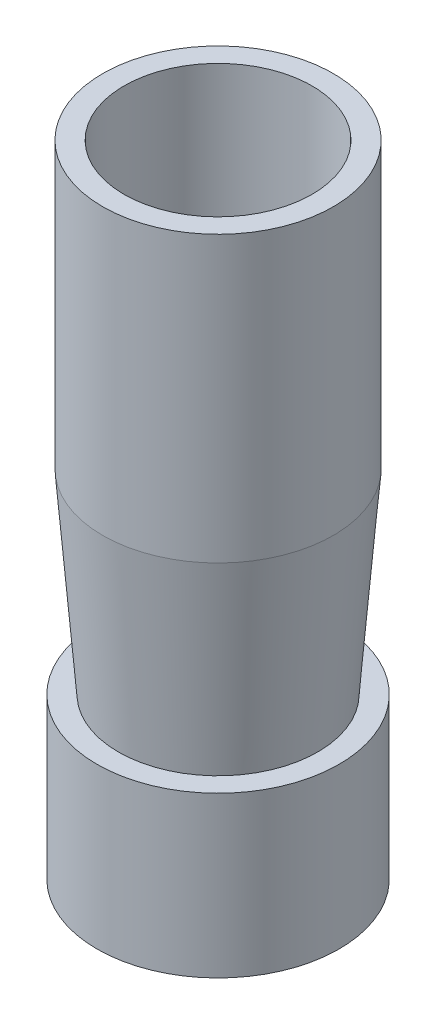
ISO-10303-21;
HEADER;
FILE_DESCRIPTION(('STEP AP214'),'2;1');
FILE_NAME('part.step','',(''),(''),'','','');
FILE_SCHEMA(('AUTOMOTIVE_DESIGN { 1 0 10303 214 1 1 1 1 }'));
ENDSEC;
DATA;
#1=APPLICATION_CONTEXT('core data for automotive mechanical design processes');
#2=APPLICATION_PROTOCOL_DEFINITION('international standard','automotive_design',2000,#1);
#3=PRODUCT_CONTEXT('',#1,'mechanical');
#4=PRODUCT('Part','Part','',(#3));
#5=PRODUCT_RELATED_PRODUCT_CATEGORY('part','',(#4));
#6=PRODUCT_DEFINITION_FORMATION('','',#4);
#7=PRODUCT_DEFINITION_CONTEXT('part definition',#1,'design');
#8=PRODUCT_DEFINITION('design','',#6,#7);
#9=PRODUCT_DEFINITION_SHAPE('','',#8);
#10=(LENGTH_UNIT() NAMED_UNIT(*) SI_UNIT(.MILLI.,.METRE.));
#11=(NAMED_UNIT(*) PLANE_ANGLE_UNIT() SI_UNIT($,.RADIAN.));
#12=(NAMED_UNIT(*) SI_UNIT($,.STERADIAN.) SOLID_ANGLE_UNIT());
#13=UNCERTAINTY_MEASURE_WITH_UNIT(LENGTH_MEASURE(1.E-05),#10,'distance_accuracy_value','');
#14=(GEOMETRIC_REPRESENTATION_CONTEXT(3) GLOBAL_UNCERTAINTY_ASSIGNED_CONTEXT((#13)) GLOBAL_UNIT_ASSIGNED_CONTEXT((#10,
#11,#12)) REPRESENTATION_CONTEXT('',''));
#15=CARTESIAN_POINT('',(0.,0.,0.));
#16=DIRECTION('',(0.,0.,1.));
#17=DIRECTION('',(1.,0.,0.));
#18=AXIS2_PLACEMENT_3D('',#15,#16,#17);
#19=CARTESIAN_POINT('',(-25.6120969503537,43.0163177549968,0.));
#20=DIRECTION('',(0.,1.,0.));
#21=DIRECTION('',(0.,0.,1.));
#22=AXIS2_PLACEMENT_3D('',#19,#20,#21);
#23=PLANE('',#22);
#24=CARTESIAN_POINT('',(-14.7970969503537,43.0163177549968,0.));
#25=DIRECTION('',(0.,1.,0.));
#26=DIRECTION('',(0.,0.,1.));
#27=AXIS2_PLACEMENT_3D('',#24,#25,#26);
#28=CIRCLE('',#27,10.815);
#29=CARTESIAN_POINT('',(-14.7970969503537,43.0163177549968,10.815));
#30=VERTEX_POINT('',#29);
#31=EDGE_CURVE('E10',#30,#30,#28,.T.);
#32=ORIENTED_EDGE('',*,*,#31,.T.);
#33=EDGE_LOOP('',(#32));
#34=FACE_BOUND('',#33,.T.);
#35=CARTESIAN_POINT('',(-14.7970969503537,43.0163177549968,0.));
#36=DIRECTION('',(0.,1.,0.));
#37=DIRECTION('',(0.,0.,1.));
#38=AXIS2_PLACEMENT_3D('',#35,#36,#37);
#39=CIRCLE('',#38,8.815);
#40=CARTESIAN_POINT('',(-14.7970969503537,43.0163177549968,8.815));
#41=VERTEX_POINT('',#40);
#42=EDGE_CURVE('E21',#41,#41,#39,.T.);
#43=ORIENTED_EDGE('',*,*,#42,.F.);
#44=EDGE_LOOP('',(#43));
#45=FACE_BOUND('',#44,.T.);
#46=ADVANCED_FACE('F14',(#34,#45),#23,.T.);
#47=CARTESIAN_POINT('',(-14.7970969503537,26.4248387096774,0.));
#48=DIRECTION('',(0.,1.,0.));
#49=DIRECTION('',(0.,0.,1.));
#50=AXIS2_PLACEMENT_3D('',#47,#48,#49);
#51=CYLINDRICAL_SURFACE('',#50,8.815);
#52=ORIENTED_EDGE('',*,*,#42,.T.);
#53=EDGE_LOOP('',(#52));
#54=FACE_BOUND('',#53,.T.);
#55=CARTESIAN_POINT('',(-14.7970969503537,26.3263177549968,0.));
#56=DIRECTION('',(0.,1.,0.));
#57=DIRECTION('',(0.,0.,1.));
#58=AXIS2_PLACEMENT_3D('',#55,#56,#57);
#59=CIRCLE('',#58,8.815);
#60=CARTESIAN_POINT('',(-14.7970969503537,26.3263177549968,8.81499999999999));
#61=VERTEX_POINT('',#60);
#62=EDGE_CURVE('E28',#61,#61,#59,.T.);
#63=ORIENTED_EDGE('',*,*,#62,.F.);
#64=EDGE_LOOP('',(#63));
#65=FACE_BOUND('',#64,.T.);
#66=ADVANCED_FACE('F97',(#54,#65),#51,.F.);
#67=CARTESIAN_POINT('',(-14.7970969503537,-12.3512431395056,0.));
#68=DIRECTION('',(0.,1.,0.));
#69=DIRECTION('',(0.,0.,1.));
#70=AXIS2_PLACEMENT_3D('',#67,#68,#69);
#71=CONICAL_SURFACE('',#70,2.75,0.155542634404642);
#72=CARTESIAN_POINT('',(-14.7970969503537,-12.3512431395056,0.));
#73=DIRECTION('',(0.,1.,0.));
#74=DIRECTION('',(0.,0.,1.));
#75=AXIS2_PLACEMENT_3D('',#72,#73,#74);
#76=CIRCLE('',#75,2.75);
#77=CARTESIAN_POINT('',(-14.7970969503537,-12.3512431395056,2.75));
#78=VERTEX_POINT('',#77);
#79=EDGE_CURVE('E34',#78,#78,#76,.T.);
#80=CARTESIAN_POINT('',(-14.7970969503537,26.3263177549968,8.81499999999999));
#81=CARTESIAN_POINT('',(-14.7970969503537,25.9234264956791,8.75182291666666));
#82=CARTESIAN_POINT('',(-14.7970969503537,25.5205352363613,8.68864583333332));
#83=CARTESIAN_POINT('',(-14.7970969503537,24.7147527177259,8.56229166666666));
#84=CARTESIAN_POINT('',(-14.7970969503537,24.3118614584081,8.49911458333333));
#85=CARTESIAN_POINT('',(-14.7970969503537,23.5060789397727,8.37276041666666));
#86=CARTESIAN_POINT('',(-14.7970969503537,23.1031876804549,8.30958333333333));
#87=CARTESIAN_POINT('',(-14.7970969503537,22.2974051618195,8.18322916666666));
#88=CARTESIAN_POINT('',(-14.7970969503537,21.8945139025017,8.12005208333332));
#89=CARTESIAN_POINT('',(-14.7970969503537,21.0887313838663,7.99369791666666));
#90=CARTESIAN_POINT('',(-14.7970969503537,20.6858401245485,7.93052083333332));
#91=CARTESIAN_POINT('',(-14.7970969503537,19.8800576059131,7.80416666666666));
#92=CARTESIAN_POINT('',(-14.7970969503537,19.4771663465953,7.74098958333333));
#93=CARTESIAN_POINT('',(-14.7970969503537,18.6713838279599,7.61463541666666));
#94=CARTESIAN_POINT('',(-14.7970969503537,18.2684925686421,7.55145833333333));
#95=CARTESIAN_POINT('',(-14.7970969503537,17.4627100500067,7.42510416666666));
#96=CARTESIAN_POINT('',(-14.7970969503537,17.0598187906889,7.36192708333333));
#97=CARTESIAN_POINT('',(-14.7970969503537,16.2540362720535,7.23557291666666));
#98=CARTESIAN_POINT('',(-14.7970969503537,15.8511450127357,7.17239583333333));
#99=CARTESIAN_POINT('',(-14.7970969503537,15.0453624941003,7.04604166666666));
#100=CARTESIAN_POINT('',(-14.7970969503537,14.6424712347825,6.98286458333333));
#101=CARTESIAN_POINT('',(-14.7970969503537,13.8366887161471,6.85651041666666));
#102=CARTESIAN_POINT('',(-14.7970969503537,13.4337974568293,6.79333333333333));
#103=CARTESIAN_POINT('',(-14.7970969503537,12.6280149381939,6.66697916666666));
#104=CARTESIAN_POINT('',(-14.7970969503537,12.2251236788761,6.60380208333333));
#105=CARTESIAN_POINT('',(-14.7970969503537,11.4193411602407,6.47744791666666));
#106=CARTESIAN_POINT('',(-14.7970969503537,11.0164499009229,6.41427083333333));
#107=CARTESIAN_POINT('',(-14.7970969503537,10.2106673822875,6.28791666666666));
#108=CARTESIAN_POINT('',(-14.7970969503537,9.80777612296974,6.22473958333333));
#109=CARTESIAN_POINT('',(-14.7970969503537,9.00199360433427,6.09838541666666));
#110=CARTESIAN_POINT('',(-14.7970969503537,8.59910234501653,6.03520833333333));
#111=CARTESIAN_POINT('',(-14.7970969503537,7.79331982638107,5.90885416666666));
#112=CARTESIAN_POINT('',(-14.7970969503537,7.39042856706333,5.84567708333333));
#113=CARTESIAN_POINT('',(-14.7970969503537,6.58464604842787,5.71932291666666));
#114=CARTESIAN_POINT('',(-14.7970969503537,6.18175478911014,5.65614583333333));
#115=CARTESIAN_POINT('',(-14.7970969503537,5.37597227047467,5.52979166666666));
#116=CARTESIAN_POINT('',(-14.7970969503537,4.97308101115693,5.46661458333333));
#117=CARTESIAN_POINT('',(-14.7970969503537,4.16729849252147,5.34026041666666));
#118=CARTESIAN_POINT('',(-14.7970969503537,3.76440723320373,5.27708333333333));
#119=CARTESIAN_POINT('',(-14.7970969503537,2.95862471456827,5.15072916666666));
#120=CARTESIAN_POINT('',(-14.7970969503537,2.55573345525053,5.08755208333333));
#121=CARTESIAN_POINT('',(-14.7970969503537,1.74995093661507,4.96119791666666));
#122=CARTESIAN_POINT('',(-14.7970969503537,1.34705967729733,4.89802083333333));
#123=CARTESIAN_POINT('',(-14.7970969503537,0.541277158661868,4.77166666666666));
#124=CARTESIAN_POINT('',(-14.7970969503537,0.138385899344135,4.70848958333333));
#125=CARTESIAN_POINT('',(-14.7970969503537,-0.667396619291332,4.58213541666666));
#126=CARTESIAN_POINT('',(-14.7970969503537,-1.07028787860907,4.51895833333333));
#127=CARTESIAN_POINT('',(-14.7970969503537,-1.87607039724453,4.39260416666666));
#128=CARTESIAN_POINT('',(-14.7970969503537,-2.27896165656227,4.32942708333333));
#129=CARTESIAN_POINT('',(-14.7970969503537,-3.08474417519773,4.20307291666666));
#130=CARTESIAN_POINT('',(-14.7970969503537,-3.48763543451546,4.13989583333333));
#131=CARTESIAN_POINT('',(-14.7970969503537,-4.29341795315093,4.01354166666666));
#132=CARTESIAN_POINT('',(-14.7970969503537,-4.69630921246867,3.95036458333333));
#133=CARTESIAN_POINT('',(-14.7970969503537,-5.50209173110413,3.82401041666666));
#134=CARTESIAN_POINT('',(-14.7970969503537,-5.90498299042187,3.76083333333333));
#135=CARTESIAN_POINT('',(-14.7970969503537,-6.71076550905733,3.63447916666666));
#136=CARTESIAN_POINT('',(-14.7970969503537,-7.11365676837507,3.57130208333333));
#137=CARTESIAN_POINT('',(-14.7970969503537,-7.91943928701053,3.44494791666667));
#138=CARTESIAN_POINT('',(-14.7970969503537,-8.32233054632827,3.38177083333333));
#139=CARTESIAN_POINT('',(-14.7970969503537,-9.12811306496373,3.25541666666667));
#140=CARTESIAN_POINT('',(-14.7970969503537,-9.53100432428147,3.19223958333333));
#141=CARTESIAN_POINT('',(-14.7970969503537,-10.3367868429169,3.06588541666667));
#142=CARTESIAN_POINT('',(-14.7970969503537,-10.7396781022347,3.00270833333333));
#143=CARTESIAN_POINT('',(-14.7970969503537,-11.5454606208701,2.87635416666667));
#144=CARTESIAN_POINT('',(-14.7970969503537,-11.9483518801879,2.81317708333333));
#145=CARTESIAN_POINT('',(-14.7970969503537,-12.3512431395056,2.75));
#146=B_SPLINE_CURVE_WITH_KNOTS('',3,(#80,#81,#82,#83,#84,#85,#86,#87,#88,#89,#90,#91,#92,#93,
#94,#95,#96,#97,#98,#99,#100,#101,#102,#103,#104,#105,#106,#107,#108,#109,#110,#111,#112,#113,
#114,#115,#116,#117,#118,#119,#120,#121,#122,#123,#124,#125,#126,#127,#128,#129,#130,#131,#132,
#133,#134,#135,#136,#137,#138,#139,#140,#141,#142,#143,#144,#145),.UNSPECIFIED.,.F.,.F.,(4,2,2,
2,2,2,2,2,2,2,2,2,2,2,2,2,2,2,2,2,2,2,2,2,2,2,2,2,2,2,2,2,4),(0.,1.22344366287877,
2.44688732575754,3.67033098863631,4.89377465151509,6.11721831439386,7.34066197727262,
8.5641056401514,9.78754930303017,11.0109929659089,12.2344366287877,13.4578802916665,
14.6813239545453,15.904767617424,17.1282112803028,18.3516549431816,19.5750986060603,
20.7985422689391,22.0219859318179,23.2454295946967,24.4688732575754,25.6923169204542,
26.915760583333,28.1392042462117,29.3626479090905,30.5860915719693,31.8095352348481,
33.0329788977268,34.2564225606056,35.4798662234844,36.7033098863631,37.9267535492419,
39.1501972121207),.UNSPECIFIED.);
#147=EDGE_CURVE('BSEAM101',#61,#78,#146,.T.);
#148=ORIENTED_EDGE('',*,*,#62,.T.);
#149=ORIENTED_EDGE('',*,*,#79,.F.);
#150=ORIENTED_EDGE('',*,*,#147,.T.);
#151=ORIENTED_EDGE('',*,*,#147,.F.);
#152=EDGE_LOOP('',(#148,#150,#149,#151));
#153=FACE_BOUND('',#152,.T.);
#154=ADVANCED_FACE('F101',(#153),#71,.F.);
#155=CARTESIAN_POINT('',(-14.7970969503537,-12.5520427359334,0.));
#156=DIRECTION('',(0.,-1.,0.));
#157=DIRECTION('',(0.,0.,-1.));
#158=AXIS2_PLACEMENT_3D('',#155,#156,#157);
#159=CONICAL_SURFACE('',#158,3.,0.894108189836582);
#160=ORIENTED_EDGE('',*,*,#79,.T.);
#161=EDGE_LOOP('',(#160));
#162=FACE_BOUND('',#161,.T.);
#163=CARTESIAN_POINT('',(-14.7970969503537,-12.5520427359334,0.));
#164=DIRECTION('',(0.,1.,0.));
#165=DIRECTION('',(0.,0.,1.));
#166=AXIS2_PLACEMENT_3D('',#163,#164,#165);
#167=CIRCLE('',#166,3.);
#168=CARTESIAN_POINT('',(-14.7970969503537,-12.5520427359334,3.));
#169=VERTEX_POINT('',#168);
#170=EDGE_CURVE('E40',#169,#169,#167,.T.);
#171=ORIENTED_EDGE('',*,*,#170,.F.);
#172=EDGE_LOOP('',(#171));
#173=FACE_BOUND('',#172,.T.);
#174=ADVANCED_FACE('F106',(#162,#173),#159,.F.);
#175=CARTESIAN_POINT('',(-14.7970969503537,23.1029597459589,0.));
#176=DIRECTION('',(0.,1.,0.));
#177=DIRECTION('',(0.,0.,1.));
#178=AXIS2_PLACEMENT_3D('',#175,#176,#177);
#179=CONICAL_SURFACE('',#178,8.815,0.161667372540477);
#180=ORIENTED_EDGE('',*,*,#170,.T.);
#181=EDGE_LOOP('',(#180));
#182=FACE_BOUND('',#181,.T.);
#183=CARTESIAN_POINT('',(-14.7970969503537,23.1029597459589,0.));
#184=DIRECTION('',(0.,1.,0.));
#185=DIRECTION('',(0.,0.,1.));
#186=AXIS2_PLACEMENT_3D('',#183,#184,#185);
#187=CIRCLE('',#186,8.815);
#188=CARTESIAN_POINT('',(-14.7970969503537,23.1029597459589,8.815));
#189=VERTEX_POINT('',#188);
#190=EDGE_CURVE('E44',#189,#189,#187,.T.);
#191=ORIENTED_EDGE('',*,*,#190,.F.);
#192=EDGE_LOOP('',(#191));
#193=FACE_BOUND('',#192,.T.);
#194=ADVANCED_FACE('F113',(#182,#193),#179,.T.);
#195=CARTESIAN_POINT('',(-14.7970969503537,26.4248387096774,0.));
#196=DIRECTION('',(0.,1.,0.));
#197=DIRECTION('',(0.,0.,1.));
#198=AXIS2_PLACEMENT_3D('',#195,#196,#197);
#199=CYLINDRICAL_SURFACE('',#198,8.815);
#200=ORIENTED_EDGE('',*,*,#190,.T.);
#201=EDGE_LOOP('',(#200));
#202=FACE_BOUND('',#201,.T.);
#203=CARTESIAN_POINT('',(-14.7970969503537,16.3263177549968,0.));
#204=DIRECTION('',(0.,1.,0.));
#205=DIRECTION('',(0.,0.,1.));
#206=AXIS2_PLACEMENT_3D('',#203,#204,#205);
#207=CIRCLE('',#206,8.815);
#208=CARTESIAN_POINT('',(-14.7970969503537,16.3263177549968,8.815));
#209=VERTEX_POINT('',#208);
#210=EDGE_CURVE('E48',#209,#209,#207,.T.);
#211=ORIENTED_EDGE('',*,*,#210,.F.);
#212=EDGE_LOOP('',(#211));
#213=FACE_BOUND('',#212,.T.);
#214=ADVANCED_FACE('F117',(#202,#213),#199,.F.);
#215=CARTESIAN_POINT('',(-14.7970969503537,-7.13260368102019,0.));
#216=DIRECTION('',(0.,1.,0.));
#217=DIRECTION('',(0.,0.,1.));
#218=AXIS2_PLACEMENT_3D('',#215,#216,#217);
#219=CONICAL_SURFACE('',#218,6.94160278866409,0.0796895082429436);
#220=ORIENTED_EDGE('',*,*,#210,.T.);
#221=EDGE_LOOP('',(#220));
#222=FACE_BOUND('',#221,.T.);
#223=CARTESIAN_POINT('',(-14.7970969503537,-7.13260368102019,0.));
#224=DIRECTION('',(0.,1.,0.));
#225=DIRECTION('',(0.,0.,1.));
#226=AXIS2_PLACEMENT_3D('',#223,#224,#225);
#227=CIRCLE('',#226,6.94160278866409);
#228=CARTESIAN_POINT('',(-14.7970969503537,-7.13260368102019,6.94160278866409));
#229=VERTEX_POINT('',#228);
#230=EDGE_CURVE('E52',#229,#229,#227,.T.);
#231=ORIENTED_EDGE('',*,*,#230,.F.);
#232=EDGE_LOOP('',(#231));
#233=FACE_BOUND('',#232,.T.);
#234=ADVANCED_FACE('F121',(#222,#233),#219,.F.);
#235=CARTESIAN_POINT('',(-14.7970969503537,26.4248387096774,0.));
#236=DIRECTION('',(0.,1.,0.));
#237=DIRECTION('',(0.,0.,1.));
#238=AXIS2_PLACEMENT_3D('',#235,#236,#237);
#239=CYLINDRICAL_SURFACE('',#238,6.94160278866409);
#240=ORIENTED_EDGE('',*,*,#230,.T.);
#241=EDGE_LOOP('',(#240));
#242=FACE_BOUND('',#241,.T.);
#243=CARTESIAN_POINT('',(-14.7970969503537,-16.9873258973576,0.));
#244=DIRECTION('',(0.,1.,0.));
#245=DIRECTION('',(0.,0.,1.));
#246=AXIS2_PLACEMENT_3D('',#243,#244,#245);
#247=CIRCLE('',#246,6.94160278866409);
#248=CARTESIAN_POINT('',(-14.7970969503537,-16.9873258973576,6.94160278866409));
#249=VERTEX_POINT('',#248);
#250=EDGE_CURVE('E56',#249,#249,#247,.T.);
#251=ORIENTED_EDGE('',*,*,#250,.F.);
#252=EDGE_LOOP('',(#251));
#253=FACE_BOUND('',#252,.T.);
#254=ADVANCED_FACE('F125',(#242,#253),#239,.F.);
#255=CARTESIAN_POINT('',(-26.1495949232434,-16.9873258973576,0.));
#256=DIRECTION('',(0.,-1.,0.));
#257=DIRECTION('',(0.,0.,-1.));
#258=AXIS2_PLACEMENT_3D('',#255,#256,#257);
#259=PLANE('',#258);
#260=ORIENTED_EDGE('',*,*,#250,.T.);
#261=EDGE_LOOP('',(#260));
#262=FACE_BOUND('',#261,.T.);
#263=CARTESIAN_POINT('',(-14.7970969503537,-16.9873258973576,0.));
#264=DIRECTION('',(0.,1.,0.));
#265=DIRECTION('',(0.,0.,1.));
#266=AXIS2_PLACEMENT_3D('',#263,#264,#265);
#267=CIRCLE('',#266,11.3524979728896);
#268=CARTESIAN_POINT('',(-14.7970969503537,-16.9873258973576,11.3524979728896));
#269=VERTEX_POINT('',#268);
#270=EDGE_CURVE('E60',#269,#269,#267,.T.);
#271=ORIENTED_EDGE('',*,*,#270,.F.);
#272=EDGE_LOOP('',(#271));
#273=FACE_BOUND('',#272,.T.);
#274=ADVANCED_FACE('F129',(#262,#273),#259,.T.);
#275=CARTESIAN_POINT('',(-14.7970969503537,26.4248387096774,0.));
#276=DIRECTION('',(0.,1.,0.));
#277=DIRECTION('',(0.,0.,1.));
#278=AXIS2_PLACEMENT_3D('',#275,#276,#277);
#279=CYLINDRICAL_SURFACE('',#278,11.3524979728896);
#280=ORIENTED_EDGE('',*,*,#270,.T.);
#281=EDGE_LOOP('',(#280));
#282=FACE_BOUND('',#281,.T.);
#283=CARTESIAN_POINT('',(-14.7970969503537,-1.98732120336022,0.));
#284=DIRECTION('',(0.,1.,0.));
#285=DIRECTION('',(0.,0.,1.));
#286=AXIS2_PLACEMENT_3D('',#283,#284,#285);
#287=CIRCLE('',#286,11.3524979728896);
#288=CARTESIAN_POINT('',(-14.7970969503537,-1.98732120336022,11.3524979728896));
#289=VERTEX_POINT('',#288);
#290=EDGE_CURVE('E64',#289,#289,#287,.T.);
#291=ORIENTED_EDGE('',*,*,#290,.F.);
#292=EDGE_LOOP('',(#291));
#293=FACE_BOUND('',#292,.T.);
#294=ADVANCED_FACE('F93',(#282,#293),#279,.T.);
#295=CARTESIAN_POINT('',(-24.1495949232433,-1.98732120336023,0.));
#296=DIRECTION('',(0.,1.,0.));
#297=DIRECTION('',(0.,0.,1.));
#298=AXIS2_PLACEMENT_3D('',#295,#296,#297);
#299=PLANE('',#298);
#300=ORIENTED_EDGE('',*,*,#290,.T.);
#301=EDGE_LOOP('',(#300));
#302=FACE_BOUND('',#301,.T.);
#303=CARTESIAN_POINT('',(-14.7970969503537,-1.98732120336022,0.));
#304=DIRECTION('',(0.,1.,0.));
#305=DIRECTION('',(0.,0.,1.));
#306=AXIS2_PLACEMENT_3D('',#303,#304,#305);
#307=CIRCLE('',#306,9.35249797288959);
#308=CARTESIAN_POINT('',(-14.7970969503537,-1.98732120336022,9.35249797288959));
#309=VERTEX_POINT('',#308);
#310=EDGE_CURVE('E68',#309,#309,#307,.T.);
#311=ORIENTED_EDGE('',*,*,#310,.F.);
#312=EDGE_LOOP('',(#311));
#313=FACE_BOUND('',#312,.T.);
#314=ADVANCED_FACE('F84',(#302,#313),#299,.T.);
#315=CARTESIAN_POINT('',(-14.7970969503537,16.3263177549968,0.));
#316=DIRECTION('',(0.,1.,0.));
#317=DIRECTION('',(0.,0.,1.));
#318=AXIS2_PLACEMENT_3D('',#315,#316,#317);
#319=CONICAL_SURFACE('',#318,10.815,0.0796895082429434);
#320=ORIENTED_EDGE('',*,*,#310,.T.);
#321=EDGE_LOOP('',(#320));
#322=FACE_BOUND('',#321,.T.);
#323=CARTESIAN_POINT('',(-14.7970969503537,16.3263177549968,0.));
#324=DIRECTION('',(0.,1.,0.));
#325=DIRECTION('',(0.,0.,1.));
#326=AXIS2_PLACEMENT_3D('',#323,#324,#325);
#327=CIRCLE('',#326,10.815);
#328=CARTESIAN_POINT('',(-14.7970969503537,16.3263177549968,10.815));
#329=VERTEX_POINT('',#328);
#330=EDGE_CURVE('E72',#329,#329,#327,.T.);
#331=ORIENTED_EDGE('',*,*,#330,.F.);
#332=EDGE_LOOP('',(#331));
#333=FACE_BOUND('',#332,.T.);
#334=ADVANCED_FACE('F82',(#322,#333),#319,.T.);
#335=CARTESIAN_POINT('',(-14.7970969503537,26.4248387096774,0.));
#336=DIRECTION('',(0.,1.,0.));
#337=DIRECTION('',(0.,0.,1.));
#338=AXIS2_PLACEMENT_3D('',#335,#336,#337);
#339=CYLINDRICAL_SURFACE('',#338,10.815);
#340=ORIENTED_EDGE('',*,*,#330,.T.);
#341=EDGE_LOOP('',(#340));
#342=FACE_BOUND('',#341,.T.);
#343=ORIENTED_EDGE('',*,*,#31,.F.);
#344=EDGE_LOOP('',(#343));
#345=FACE_BOUND('',#344,.T.);
#346=ADVANCED_FACE('F79',(#342,#345),#339,.T.);
#347=CLOSED_SHELL('',(#46,#66,#154,#174,#194,#214,#234,#254,#274,#294,#314,#334,#346));
#348=MANIFOLD_SOLID_BREP('B1',#347);
#349=ADVANCED_BREP_SHAPE_REPRESENTATION('',(#18,#348),#14);
#350=SHAPE_DEFINITION_REPRESENTATION(#9,#349);
ENDSEC;
END-ISO-10303-21;
